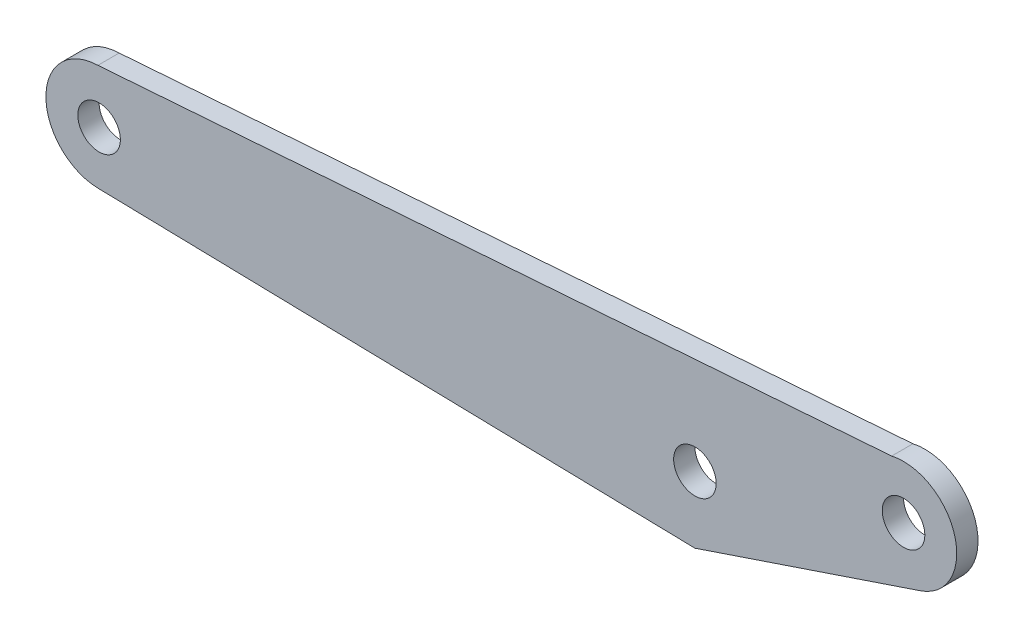
ISO-10303-21;
HEADER;
FILE_DESCRIPTION(('STEP AP214'),'2;1');
FILE_NAME('part.step','',(''),(''),'','','');
FILE_SCHEMA(('AUTOMOTIVE_DESIGN { 1 0 10303 214 1 1 1 1 }'));
ENDSEC;
DATA;
#1=APPLICATION_CONTEXT('core data for automotive mechanical design processes');
#2=APPLICATION_PROTOCOL_DEFINITION('international standard','automotive_design',2000,#1);
#3=PRODUCT_CONTEXT('',#1,'mechanical');
#4=PRODUCT('Part','Part','',(#3));
#5=PRODUCT_RELATED_PRODUCT_CATEGORY('part','',(#4));
#6=PRODUCT_DEFINITION_FORMATION('','',#4);
#7=PRODUCT_DEFINITION_CONTEXT('part definition',#1,'design');
#8=PRODUCT_DEFINITION('design','',#6,#7);
#9=PRODUCT_DEFINITION_SHAPE('','',#8);
#10=(LENGTH_UNIT() NAMED_UNIT(*) SI_UNIT(.MILLI.,.METRE.));
#11=(NAMED_UNIT(*) PLANE_ANGLE_UNIT() SI_UNIT($,.RADIAN.));
#12=(NAMED_UNIT(*) SI_UNIT($,.STERADIAN.) SOLID_ANGLE_UNIT());
#13=UNCERTAINTY_MEASURE_WITH_UNIT(LENGTH_MEASURE(1.E-05),#10,'distance_accuracy_value','');
#14=(GEOMETRIC_REPRESENTATION_CONTEXT(3) GLOBAL_UNCERTAINTY_ASSIGNED_CONTEXT((#13)) GLOBAL_UNIT_ASSIGNED_CONTEXT((#10,
#11,#12)) REPRESENTATION_CONTEXT('',''));
#15=CARTESIAN_POINT('',(0.,0.,0.));
#16=DIRECTION('',(0.,0.,1.));
#17=DIRECTION('',(1.,0.,0.));
#18=AXIS2_PLACEMENT_3D('',#15,#16,#17);
#19=CARTESIAN_POINT('',(39.2194771942834,11.2460041173336,4.));
#20=DIRECTION('',(0.,0.,-1.));
#21=DIRECTION('',(-1.,0.,0.));
#22=AXIS2_PLACEMENT_3D('',#19,#20,#21);
#23=CYLINDRICAL_SURFACE('',#22,10.);
#24=CARTESIAN_POINT('',(39.2194771942834,11.2460041173336,0.));
#25=DIRECTION('',(0.,0.,1.));
#26=DIRECTION('',(1.,0.,0.));
#27=AXIS2_PLACEMENT_3D('',#24,#25,#26);
#28=CIRCLE('',#27,10.);
#29=CARTESIAN_POINT('',(42.4082855368817,1.76805595572312,0.));
#30=VERTEX_POINT('',#29);
#31=CARTESIAN_POINT('',(36.981350661056,20.9923259682301,0.));
#32=VERTEX_POINT('',#31);
#33=EDGE_CURVE('E138',#30,#32,#28,.T.);
#34=ORIENTED_EDGE('',*,*,#33,.T.);
#35=DIRECTION('',(0.,0.,-1.));
#36=VECTOR('',#35,1.);
#37=CARTESIAN_POINT('',(36.981350661056,20.9923259682301,4.));
#38=LINE('',#37,#36);
#39=CARTESIAN_POINT('',(36.981350661056,20.9923259682301,4.));
#40=VERTEX_POINT('',#39);
#41=EDGE_CURVE('E11',#40,#32,#38,.T.);
#42=ORIENTED_EDGE('',*,*,#41,.F.);
#43=CARTESIAN_POINT('',(39.2194771942834,11.2460041173336,4.));
#44=DIRECTION('',(0.,0.,1.));
#45=DIRECTION('',(1.,0.,0.));
#46=AXIS2_PLACEMENT_3D('',#43,#44,#45);
#47=CIRCLE('',#46,10.);
#48=CARTESIAN_POINT('',(42.4082855368817,1.76805595572312,4.));
#49=VERTEX_POINT('',#48);
#50=EDGE_CURVE('E95',#49,#40,#47,.T.);
#51=ORIENTED_EDGE('',*,*,#50,.F.);
#52=DIRECTION('',(0.,0.,-1.));
#53=VECTOR('',#52,1.);
#54=CARTESIAN_POINT('',(42.4082855368817,1.76805595572312,4.));
#55=LINE('',#54,#53);
#56=EDGE_CURVE('E133',#49,#30,#55,.T.);
#57=ORIENTED_EDGE('',*,*,#56,.T.);
#58=EDGE_LOOP('',(#34,#42,#51,#57));
#59=FACE_BOUND('',#58,.T.);
#60=ADVANCED_FACE('F42',(#59),#23,.T.);
#61=CARTESIAN_POINT('',(-1.33883221389853,18.1685252092473,4.));
#62=DIRECTION('',(-0.0734903849746249,0.997295925649093,0.));
#63=DIRECTION('',(-0.997295925649093,-0.0734903849746249,0.));
#64=AXIS2_PLACEMENT_3D('',#61,#62,#63);
#65=PLANE('',#64);
#66=DIRECTION('',(0.997295925649093,0.0734903849746249,0.));
#67=VECTOR('',#66,1.);
#68=CARTESIAN_POINT('',(-1.33883221389853,18.1685252092473,0.));
#69=LINE('',#68,#67);
#70=CARTESIAN_POINT('',(-112.222936902681,9.99751464802242,0.));
#71=VERTEX_POINT('',#70);
#72=EDGE_CURVE('E137',#71,#32,#69,.T.);
#73=ORIENTED_EDGE('',*,*,#72,.F.);
#74=DIRECTION('',(0.,0.,-1.));
#75=VECTOR('',#74,1.);
#76=CARTESIAN_POINT('',(-112.222936902681,9.99751464802242,4.));
#77=LINE('',#76,#75);
#78=CARTESIAN_POINT('',(-112.222936902681,9.99751464802242,4.));
#79=VERTEX_POINT('',#78);
#80=EDGE_CURVE('E52',#79,#71,#77,.T.);
#81=ORIENTED_EDGE('',*,*,#80,.F.);
#82=DIRECTION('',(0.997295925649093,0.0734903849746249,0.));
#83=VECTOR('',#82,1.);
#84=CARTESIAN_POINT('',(-1.33883221389853,18.1685252092473,4.));
#85=LINE('',#84,#83);
#86=EDGE_CURVE('E104',#79,#40,#85,.T.);
#87=ORIENTED_EDGE('',*,*,#86,.T.);
#88=ORIENTED_EDGE('',*,*,#41,.T.);
#89=EDGE_LOOP('',(#73,#81,#87,#88));
#90=FACE_BOUND('',#89,.T.);
#91=ADVANCED_FACE('F175',(#90),#65,.T.);
#92=CARTESIAN_POINT('',(-112.,0.,4.));
#93=DIRECTION('',(0.,0.,-1.));
#94=DIRECTION('',(-1.,0.,0.));
#95=AXIS2_PLACEMENT_3D('',#92,#93,#94);
#96=CYLINDRICAL_SURFACE('',#95,10.);
#97=CARTESIAN_POINT('',(-112.,0.,0.));
#98=DIRECTION('',(0.,0.,1.));
#99=DIRECTION('',(1.,0.,0.));
#100=AXIS2_PLACEMENT_3D('',#97,#98,#99);
#101=CIRCLE('',#100,10.);
#102=CARTESIAN_POINT('',(-112.222936902681,-9.99751464802242,0.));
#103=VERTEX_POINT('',#102);
#104=EDGE_CURVE('E115',#71,#103,#101,.T.);
#105=ORIENTED_EDGE('',*,*,#104,.T.);
#106=DIRECTION('',(0.,0.,-1.));
#107=VECTOR('',#106,1.);
#108=CARTESIAN_POINT('',(-112.222936902681,-9.99751464802242,4.));
#109=LINE('',#108,#107);
#110=CARTESIAN_POINT('',(-112.222936902681,-9.99751464802242,4.));
#111=VERTEX_POINT('',#110);
#112=EDGE_CURVE('E108',#111,#103,#109,.T.);
#113=ORIENTED_EDGE('',*,*,#112,.F.);
#114=CARTESIAN_POINT('',(-112.,0.,4.));
#115=DIRECTION('',(0.,0.,1.));
#116=DIRECTION('',(1.,0.,0.));
#117=AXIS2_PLACEMENT_3D('',#114,#115,#116);
#118=CIRCLE('',#117,10.);
#119=EDGE_CURVE('E98',#79,#111,#118,.T.);
#120=ORIENTED_EDGE('',*,*,#119,.F.);
#121=ORIENTED_EDGE('',*,*,#80,.T.);
#122=EDGE_LOOP('',(#105,#113,#120,#121));
#123=FACE_BOUND('',#122,.T.);
#124=ADVANCED_FACE('F109',(#123),#96,.T.);
#125=CARTESIAN_POINT('',(-0.278601868767349,-12.4937873921779,4.));
#126=DIRECTION('',(0.0222936902681074,0.999751464802243,0.));
#127=DIRECTION('',(-0.999751464802243,0.0222936902681074,0.));
#128=AXIS2_PLACEMENT_3D('',#125,#126,#127);
#129=PLANE('',#128);
#130=DIRECTION('',(0.999751464802243,-0.0222936902681075,0.));
#131=VECTOR('',#130,1.);
#132=CARTESIAN_POINT('',(-0.278601868767349,-12.4937873921779,0.));
#133=LINE('',#132,#131);
#134=CARTESIAN_POINT('',(0.,-12.5,0.));
#135=VERTEX_POINT('',#134);
#136=EDGE_CURVE('E78',#103,#135,#133,.T.);
#137=ORIENTED_EDGE('',*,*,#136,.T.);
#138=DIRECTION('',(0.,0.,-1.));
#139=VECTOR('',#138,1.);
#140=CARTESIAN_POINT('',(0.,-12.5,4.));
#141=LINE('',#140,#139);
#142=CARTESIAN_POINT('',(0.,-12.5,4.));
#143=VERTEX_POINT('',#142);
#144=EDGE_CURVE('E111',#143,#135,#141,.T.);
#145=ORIENTED_EDGE('',*,*,#144,.F.);
#146=DIRECTION('',(0.999751464802243,-0.0222936902681075,0.));
#147=VECTOR('',#146,1.);
#148=CARTESIAN_POINT('',(-0.278601868767349,-12.4937873921779,4.));
#149=LINE('',#148,#147);
#150=EDGE_CURVE('E103',#111,#143,#149,.T.);
#151=ORIENTED_EDGE('',*,*,#150,.F.);
#152=ORIENTED_EDGE('',*,*,#112,.T.);
#153=EDGE_LOOP('',(#137,#145,#151,#152));
#154=FACE_BOUND('',#153,.T.);
#155=ADVANCED_FACE('F117',(#154),#129,.F.);
#156=CARTESIAN_POINT('',(39.2194771942834,11.2460041173336,4.));
#157=DIRECTION('',(0.,0.,-1.));
#158=DIRECTION('',(-1.,0.,0.));
#159=AXIS2_PLACEMENT_3D('',#156,#157,#158);
#160=CYLINDRICAL_SURFACE('',#159,4.);
#161=CARTESIAN_POINT('',(39.2194771942834,11.2460041173336,4.));
#162=DIRECTION('',(0.,0.,1.));
#163=DIRECTION('',(1.,0.,0.));
#164=AXIS2_PLACEMENT_3D('',#161,#162,#163);
#165=CIRCLE('',#164,4.);
#166=CARTESIAN_POINT('',(43.2194771942834,11.2460041173336,4.));
#167=VERTEX_POINT('',#166);
#168=EDGE_CURVE('E130',#167,#167,#165,.T.);
#169=ORIENTED_EDGE('',*,*,#168,.T.);
#170=EDGE_LOOP('',(#169));
#171=FACE_BOUND('',#170,.T.);
#172=CARTESIAN_POINT('',(39.2194771942834,11.2460041173336,0.));
#173=DIRECTION('',(0.,0.,1.));
#174=DIRECTION('',(1.,0.,0.));
#175=AXIS2_PLACEMENT_3D('',#172,#173,#174);
#176=CIRCLE('',#175,4.);
#177=CARTESIAN_POINT('',(43.2194771942834,11.2460041173336,0.));
#178=VERTEX_POINT('',#177);
#179=EDGE_CURVE('E152',#178,#178,#176,.T.);
#180=ORIENTED_EDGE('',*,*,#179,.F.);
#181=EDGE_LOOP('',(#180));
#182=FACE_BOUND('',#181,.T.);
#183=ADVANCED_FACE('F183',(#171,#182),#160,.F.);
#184=CARTESIAN_POINT('',(-112.,0.,4.));
#185=DIRECTION('',(0.,0.,-1.));
#186=DIRECTION('',(-1.,0.,0.));
#187=AXIS2_PLACEMENT_3D('',#184,#185,#186);
#188=CYLINDRICAL_SURFACE('',#187,3.99999999999999);
#189=CARTESIAN_POINT('',(-112.,0.,4.));
#190=DIRECTION('',(0.,0.,1.));
#191=DIRECTION('',(1.,0.,0.));
#192=AXIS2_PLACEMENT_3D('',#189,#190,#191);
#193=CIRCLE('',#192,3.99999999999999);
#194=CARTESIAN_POINT('',(-108.,0.,4.));
#195=VERTEX_POINT('',#194);
#196=EDGE_CURVE('E118',#195,#195,#193,.T.);
#197=ORIENTED_EDGE('',*,*,#196,.T.);
#198=EDGE_LOOP('',(#197));
#199=FACE_BOUND('',#198,.T.);
#200=CARTESIAN_POINT('',(-112.,0.,0.));
#201=DIRECTION('',(0.,0.,1.));
#202=DIRECTION('',(1.,0.,0.));
#203=AXIS2_PLACEMENT_3D('',#200,#201,#202);
#204=CIRCLE('',#203,3.99999999999999);
#205=CARTESIAN_POINT('',(-108.,0.,0.));
#206=VERTEX_POINT('',#205);
#207=EDGE_CURVE('E147',#206,#206,#204,.T.);
#208=ORIENTED_EDGE('',*,*,#207,.F.);
#209=EDGE_LOOP('',(#208));
#210=FACE_BOUND('',#209,.T.);
#211=ADVANCED_FACE('F180',(#199,#210),#188,.F.);
#212=CARTESIAN_POINT('',(3.77792002105726,-11.2289376692719,4.));
#213=DIRECTION('',(-0.318880834259834,0.947794816161046,0.));
#214=DIRECTION('',(-0.947794816161047,-0.318880834259834,0.));
#215=AXIS2_PLACEMENT_3D('',#212,#213,#214);
#216=PLANE('',#215);
#217=DIRECTION('',(0.947794816161047,0.318880834259834,0.));
#218=VECTOR('',#217,1.);
#219=CARTESIAN_POINT('',(3.77792002105726,-11.2289376692719,0.));
#220=LINE('',#219,#218);
#221=EDGE_CURVE('E88',#135,#30,#220,.T.);
#222=ORIENTED_EDGE('',*,*,#221,.T.);
#223=ORIENTED_EDGE('',*,*,#56,.F.);
#224=DIRECTION('',(0.947794816161047,0.318880834259834,0.));
#225=VECTOR('',#224,1.);
#226=CARTESIAN_POINT('',(3.77792002105726,-11.2289376692719,4.));
#227=LINE('',#226,#225);
#228=EDGE_CURVE('E62',#143,#49,#227,.T.);
#229=ORIENTED_EDGE('',*,*,#228,.F.);
#230=ORIENTED_EDGE('',*,*,#144,.T.);
#231=EDGE_LOOP('',(#222,#223,#229,#230));
#232=FACE_BOUND('',#231,.T.);
#233=ADVANCED_FACE('F171',(#232),#216,.F.);
#234=CARTESIAN_POINT('',(0.,0.,4.));
#235=DIRECTION('',(0.,0.,-1.));
#236=DIRECTION('',(-1.,0.,0.));
#237=AXIS2_PLACEMENT_3D('',#234,#235,#236);
#238=CYLINDRICAL_SURFACE('',#237,4.);
#239=CARTESIAN_POINT('',(0.,0.,4.));
#240=DIRECTION('',(0.,0.,1.));
#241=DIRECTION('',(1.,0.,0.));
#242=AXIS2_PLACEMENT_3D('',#239,#240,#241);
#243=CIRCLE('',#242,4.);
#244=CARTESIAN_POINT('',(4.,0.,4.));
#245=VERTEX_POINT('',#244);
#246=EDGE_CURVE('E132',#245,#245,#243,.T.);
#247=ORIENTED_EDGE('',*,*,#246,.T.);
#248=EDGE_LOOP('',(#247));
#249=FACE_BOUND('',#248,.T.);
#250=CARTESIAN_POINT('',(0.,0.,0.));
#251=DIRECTION('',(0.,0.,1.));
#252=DIRECTION('',(1.,0.,0.));
#253=AXIS2_PLACEMENT_3D('',#250,#251,#252);
#254=CIRCLE('',#253,4.);
#255=CARTESIAN_POINT('',(4.,0.,0.));
#256=VERTEX_POINT('',#255);
#257=EDGE_CURVE('E158',#256,#256,#254,.T.);
#258=ORIENTED_EDGE('',*,*,#257,.F.);
#259=EDGE_LOOP('',(#258));
#260=FACE_BOUND('',#259,.T.);
#261=ADVANCED_FACE('F178',(#249,#260),#238,.F.);
#262=CARTESIAN_POINT('',(0.,0.,4.));
#263=DIRECTION('',(0.,0.,1.));
#264=DIRECTION('',(1.,0.,0.));
#265=AXIS2_PLACEMENT_3D('',#262,#263,#264);
#266=PLANE('',#265);
#267=ORIENTED_EDGE('',*,*,#50,.T.);
#268=ORIENTED_EDGE('',*,*,#86,.F.);
#269=ORIENTED_EDGE('',*,*,#119,.T.);
#270=ORIENTED_EDGE('',*,*,#150,.T.);
#271=ORIENTED_EDGE('',*,*,#228,.T.);
#272=EDGE_LOOP('',(#267,#268,#269,#270,#271));
#273=FACE_BOUND('',#272,.T.);
#274=ORIENTED_EDGE('',*,*,#196,.F.);
#275=EDGE_LOOP('',(#274));
#276=FACE_BOUND('',#275,.T.);
#277=ORIENTED_EDGE('',*,*,#168,.F.);
#278=EDGE_LOOP('',(#277));
#279=FACE_BOUND('',#278,.T.);
#280=ORIENTED_EDGE('',*,*,#246,.F.);
#281=EDGE_LOOP('',(#280));
#282=FACE_BOUND('',#281,.T.);
#283=ADVANCED_FACE('F99',(#273,#276,#279,#282),#266,.T.);
#284=CARTESIAN_POINT('',(0.,0.,0.));
#285=DIRECTION('',(0.,0.,1.));
#286=DIRECTION('',(1.,0.,0.));
#287=AXIS2_PLACEMENT_3D('',#284,#285,#286);
#288=PLANE('',#287);
#289=ORIENTED_EDGE('',*,*,#33,.F.);
#290=ORIENTED_EDGE('',*,*,#221,.F.);
#291=ORIENTED_EDGE('',*,*,#136,.F.);
#292=ORIENTED_EDGE('',*,*,#104,.F.);
#293=ORIENTED_EDGE('',*,*,#72,.T.);
#294=EDGE_LOOP('',(#289,#290,#291,#292,#293));
#295=FACE_BOUND('',#294,.T.);
#296=ORIENTED_EDGE('',*,*,#207,.T.);
#297=EDGE_LOOP('',(#296));
#298=FACE_BOUND('',#297,.T.);
#299=ORIENTED_EDGE('',*,*,#179,.T.);
#300=EDGE_LOOP('',(#299));
#301=FACE_BOUND('',#300,.T.);
#302=ORIENTED_EDGE('',*,*,#257,.T.);
#303=EDGE_LOOP('',(#302));
#304=FACE_BOUND('',#303,.T.);
#305=ADVANCED_FACE('F168',(#295,#298,#301,#304),#288,.F.);
#306=CLOSED_SHELL('',(#60,#91,#124,#155,#183,#211,#233,#261,#283,#305));
#307=MANIFOLD_SOLID_BREP('B2',#306);
#308=ADVANCED_BREP_SHAPE_REPRESENTATION('',(#18,#307),#14);
#309=SHAPE_DEFINITION_REPRESENTATION(#9,#308);
ENDSEC;
END-ISO-10303-21;
